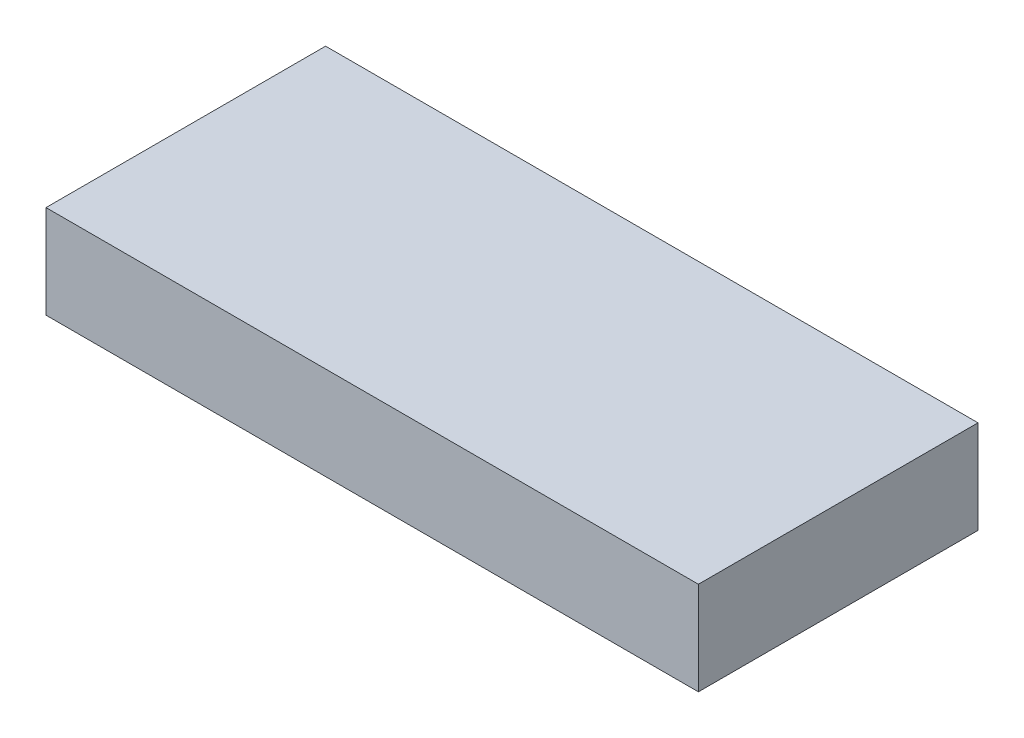
ISO-10303-21;
HEADER;
FILE_DESCRIPTION(('STEP AP214'),'2;1');
FILE_NAME('part.step','',(''),(''),'','','');
FILE_SCHEMA(('AUTOMOTIVE_DESIGN { 1 0 10303 214 1 1 1 1 }'));
ENDSEC;
DATA;
#1=APPLICATION_CONTEXT('core data for automotive mechanical design processes');
#2=APPLICATION_PROTOCOL_DEFINITION('international standard','automotive_design',2000,#1);
#3=PRODUCT_CONTEXT('',#1,'mechanical');
#4=PRODUCT('Part','Part','',(#3));
#5=PRODUCT_RELATED_PRODUCT_CATEGORY('part','',(#4));
#6=PRODUCT_DEFINITION_FORMATION('','',#4);
#7=PRODUCT_DEFINITION_CONTEXT('part definition',#1,'design');
#8=PRODUCT_DEFINITION('design','',#6,#7);
#9=PRODUCT_DEFINITION_SHAPE('','',#8);
#10=(LENGTH_UNIT() NAMED_UNIT(*) SI_UNIT(.MILLI.,.METRE.));
#11=(NAMED_UNIT(*) PLANE_ANGLE_UNIT() SI_UNIT($,.RADIAN.));
#12=(NAMED_UNIT(*) SI_UNIT($,.STERADIAN.) SOLID_ANGLE_UNIT());
#13=UNCERTAINTY_MEASURE_WITH_UNIT(LENGTH_MEASURE(1.E-05),#10,'distance_accuracy_value','');
#14=(GEOMETRIC_REPRESENTATION_CONTEXT(3) GLOBAL_UNCERTAINTY_ASSIGNED_CONTEXT((#13)) GLOBAL_UNIT_ASSIGNED_CONTEXT((#10,
#11,#12)) REPRESENTATION_CONTEXT('',''));
#15=CARTESIAN_POINT('',(0.,0.,0.));
#16=DIRECTION('',(0.,0.,1.));
#17=DIRECTION('',(1.,0.,0.));
#18=AXIS2_PLACEMENT_3D('',#15,#16,#17);
#19=CARTESIAN_POINT('',(35.,10.,15.));
#20=DIRECTION('',(-1.,0.,0.));
#21=DIRECTION('',(0.,0.,1.));
#22=AXIS2_PLACEMENT_3D('',#19,#20,#21);
#23=PLANE('',#22);
#24=DIRECTION('',(0.,0.,-1.));
#25=VECTOR('',#24,1.);
#26=CARTESIAN_POINT('',(35.,0.,15.));
#27=LINE('',#26,#25);
#28=CARTESIAN_POINT('',(35.,0.,15.));
#29=VERTEX_POINT('',#28);
#30=CARTESIAN_POINT('',(35.,0.,-15.));
#31=VERTEX_POINT('',#30);
#32=EDGE_CURVE('E96',#29,#31,#27,.T.);
#33=ORIENTED_EDGE('',*,*,#32,.T.);
#34=DIRECTION('',(0.,-1.,0.));
#35=VECTOR('',#34,1.);
#36=CARTESIAN_POINT('',(35.,10.,-15.));
#37=LINE('',#36,#35);
#38=CARTESIAN_POINT('',(35.,10.,-15.));
#39=VERTEX_POINT('',#38);
#40=EDGE_CURVE('E11',#39,#31,#37,.T.);
#41=ORIENTED_EDGE('',*,*,#40,.F.);
#42=DIRECTION('',(0.,0.,-1.));
#43=VECTOR('',#42,1.);
#44=CARTESIAN_POINT('',(35.,10.,15.));
#45=LINE('',#44,#43);
#46=CARTESIAN_POINT('',(35.,10.,15.));
#47=VERTEX_POINT('',#46);
#48=EDGE_CURVE('E84',#47,#39,#45,.T.);
#49=ORIENTED_EDGE('',*,*,#48,.F.);
#50=DIRECTION('',(0.,-1.,0.));
#51=VECTOR('',#50,1.);
#52=CARTESIAN_POINT('',(35.,10.,15.));
#53=LINE('',#52,#51);
#54=EDGE_CURVE('E92',#47,#29,#53,.T.);
#55=ORIENTED_EDGE('',*,*,#54,.T.);
#56=EDGE_LOOP('',(#33,#41,#49,#55));
#57=FACE_BOUND('',#56,.T.);
#58=ADVANCED_FACE('F33',(#57),#23,.F.);
#59=CARTESIAN_POINT('',(-35.,10.,-15.));
#60=DIRECTION('',(0.,0.,1.));
#61=DIRECTION('',(1.,0.,0.));
#62=AXIS2_PLACEMENT_3D('',#59,#60,#61);
#63=PLANE('',#62);
#64=DIRECTION('',(-1.,0.,0.));
#65=VECTOR('',#64,1.);
#66=CARTESIAN_POINT('',(-35.,0.,-15.));
#67=LINE('',#66,#65);
#68=CARTESIAN_POINT('',(-35.,0.,-15.));
#69=VERTEX_POINT('',#68);
#70=EDGE_CURVE('E88',#31,#69,#67,.T.);
#71=ORIENTED_EDGE('',*,*,#70,.T.);
#72=DIRECTION('',(0.,-1.,0.));
#73=VECTOR('',#72,1.);
#74=CARTESIAN_POINT('',(-35.,10.,-15.));
#75=LINE('',#74,#73);
#76=CARTESIAN_POINT('',(-35.,10.,-15.));
#77=VERTEX_POINT('',#76);
#78=EDGE_CURVE('E41',#77,#69,#75,.T.);
#79=ORIENTED_EDGE('',*,*,#78,.F.);
#80=DIRECTION('',(-1.,0.,0.));
#81=VECTOR('',#80,1.);
#82=CARTESIAN_POINT('',(-35.,10.,-15.));
#83=LINE('',#82,#81);
#84=EDGE_CURVE('E79',#39,#77,#83,.T.);
#85=ORIENTED_EDGE('',*,*,#84,.F.);
#86=ORIENTED_EDGE('',*,*,#40,.T.);
#87=EDGE_LOOP('',(#71,#79,#85,#86));
#88=FACE_BOUND('',#87,.T.);
#89=ADVANCED_FACE('F87',(#88),#63,.F.);
#90=CARTESIAN_POINT('',(-35.,10.,15.));
#91=DIRECTION('',(1.,0.,0.));
#92=DIRECTION('',(0.,0.,-1.));
#93=AXIS2_PLACEMENT_3D('',#90,#91,#92);
#94=PLANE('',#93);
#95=DIRECTION('',(0.,0.,1.));
#96=VECTOR('',#95,1.);
#97=CARTESIAN_POINT('',(-35.,0.,15.));
#98=LINE('',#97,#96);
#99=CARTESIAN_POINT('',(-35.,0.,15.));
#100=VERTEX_POINT('',#99);
#101=EDGE_CURVE('E66',#69,#100,#98,.T.);
#102=ORIENTED_EDGE('',*,*,#101,.T.);
#103=DIRECTION('',(0.,-1.,0.));
#104=VECTOR('',#103,1.);
#105=CARTESIAN_POINT('',(-35.,10.,15.));
#106=LINE('',#105,#104);
#107=CARTESIAN_POINT('',(-35.,10.,15.));
#108=VERTEX_POINT('',#107);
#109=EDGE_CURVE('E89',#108,#100,#106,.T.);
#110=ORIENTED_EDGE('',*,*,#109,.F.);
#111=DIRECTION('',(0.,0.,1.));
#112=VECTOR('',#111,1.);
#113=CARTESIAN_POINT('',(-35.,10.,15.));
#114=LINE('',#113,#112);
#115=EDGE_CURVE('E82',#77,#108,#114,.T.);
#116=ORIENTED_EDGE('',*,*,#115,.F.);
#117=ORIENTED_EDGE('',*,*,#78,.T.);
#118=EDGE_LOOP('',(#102,#110,#116,#117));
#119=FACE_BOUND('',#118,.T.);
#120=ADVANCED_FACE('F90',(#119),#94,.F.);
#121=CARTESIAN_POINT('',(-35.,10.,15.));
#122=DIRECTION('',(0.,0.,-1.));
#123=DIRECTION('',(-1.,0.,0.));
#124=AXIS2_PLACEMENT_3D('',#121,#122,#123);
#125=PLANE('',#124);
#126=DIRECTION('',(1.,0.,0.));
#127=VECTOR('',#126,1.);
#128=CARTESIAN_POINT('',(-35.,0.,15.));
#129=LINE('',#128,#127);
#130=EDGE_CURVE('E72',#100,#29,#129,.T.);
#131=ORIENTED_EDGE('',*,*,#130,.T.);
#132=ORIENTED_EDGE('',*,*,#54,.F.);
#133=DIRECTION('',(1.,0.,0.));
#134=VECTOR('',#133,1.);
#135=CARTESIAN_POINT('',(-35.,10.,15.));
#136=LINE('',#135,#134);
#137=EDGE_CURVE('E49',#108,#47,#136,.T.);
#138=ORIENTED_EDGE('',*,*,#137,.F.);
#139=ORIENTED_EDGE('',*,*,#109,.T.);
#140=EDGE_LOOP('',(#131,#132,#138,#139));
#141=FACE_BOUND('',#140,.T.);
#142=ADVANCED_FACE('F103',(#141),#125,.F.);
#143=CARTESIAN_POINT('',(0.,10.,0.));
#144=DIRECTION('',(0.,-1.,0.));
#145=DIRECTION('',(0.,0.,-1.));
#146=AXIS2_PLACEMENT_3D('',#143,#144,#145);
#147=PLANE('',#146);
#148=ORIENTED_EDGE('',*,*,#48,.T.);
#149=ORIENTED_EDGE('',*,*,#84,.T.);
#150=ORIENTED_EDGE('',*,*,#115,.T.);
#151=ORIENTED_EDGE('',*,*,#137,.T.);
#152=EDGE_LOOP('',(#148,#149,#150,#151));
#153=FACE_BOUND('',#152,.T.);
#154=ADVANCED_FACE('F80',(#153),#147,.F.);
#155=CARTESIAN_POINT('',(0.,0.,0.));
#156=DIRECTION('',(0.,-1.,0.));
#157=DIRECTION('',(0.,0.,-1.));
#158=AXIS2_PLACEMENT_3D('',#155,#156,#157);
#159=PLANE('',#158);
#160=ORIENTED_EDGE('',*,*,#32,.F.);
#161=ORIENTED_EDGE('',*,*,#130,.F.);
#162=ORIENTED_EDGE('',*,*,#101,.F.);
#163=ORIENTED_EDGE('',*,*,#70,.F.);
#164=EDGE_LOOP('',(#160,#161,#162,#163));
#165=FACE_BOUND('',#164,.T.);
#166=ADVANCED_FACE('F106',(#165),#159,.T.);
#167=CLOSED_SHELL('',(#58,#89,#120,#142,#154,#166));
#168=MANIFOLD_SOLID_BREP('B2',#167);
#169=ADVANCED_BREP_SHAPE_REPRESENTATION('',(#18,#168),#14);
#170=SHAPE_DEFINITION_REPRESENTATION(#9,#169);
ENDSEC;
END-ISO-10303-21;
